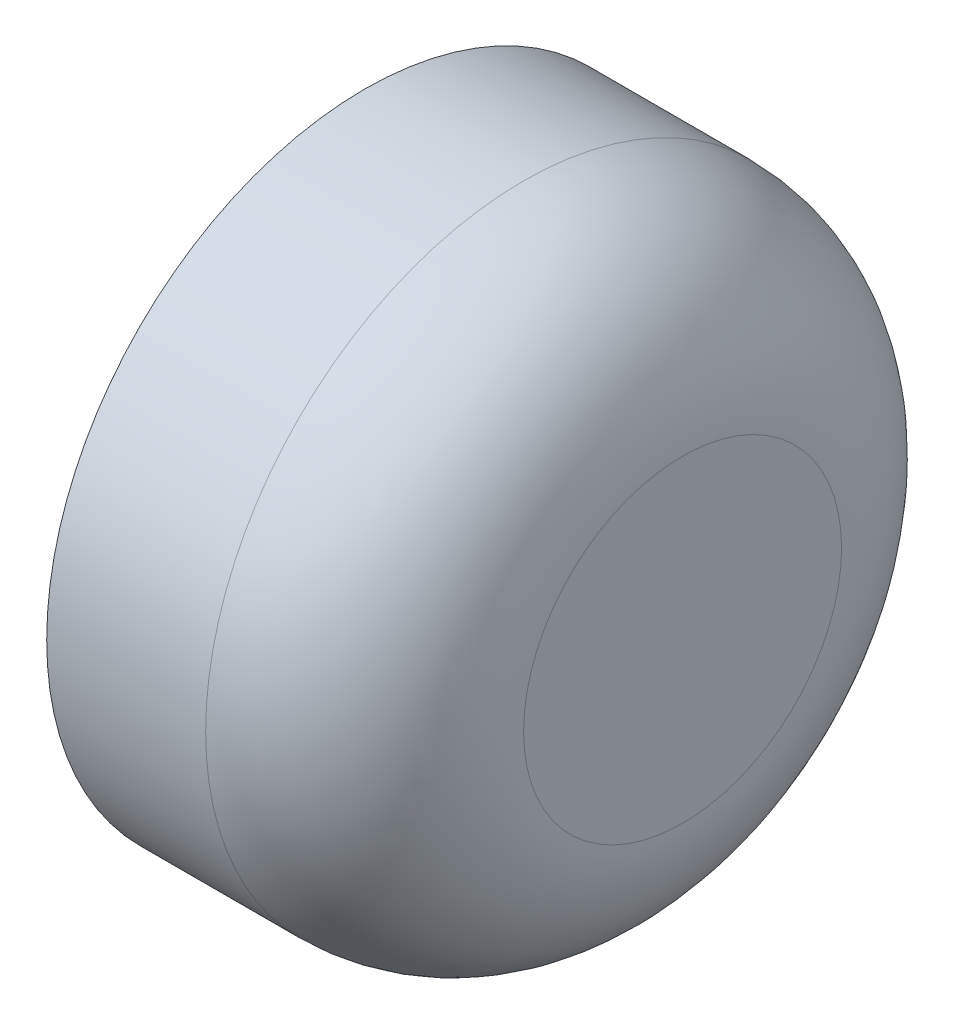
ISO-10303-21;
HEADER;
FILE_DESCRIPTION(('STEP AP214'),'2;1');
FILE_NAME('part.step','',(''),(''),'','','');
FILE_SCHEMA(('AUTOMOTIVE_DESIGN { 1 0 10303 214 1 1 1 1 }'));
ENDSEC;
DATA;
#1=APPLICATION_CONTEXT('core data for automotive mechanical design processes');
#2=APPLICATION_PROTOCOL_DEFINITION('international standard','automotive_design',2000,#1);
#3=PRODUCT_CONTEXT('',#1,'mechanical');
#4=PRODUCT('Part','Part','',(#3));
#5=PRODUCT_RELATED_PRODUCT_CATEGORY('part','',(#4));
#6=PRODUCT_DEFINITION_FORMATION('','',#4);
#7=PRODUCT_DEFINITION_CONTEXT('part definition',#1,'design');
#8=PRODUCT_DEFINITION('design','',#6,#7);
#9=PRODUCT_DEFINITION_SHAPE('','',#8);
#10=(LENGTH_UNIT() NAMED_UNIT(*) SI_UNIT(.MILLI.,.METRE.));
#11=(NAMED_UNIT(*) PLANE_ANGLE_UNIT() SI_UNIT($,.RADIAN.));
#12=(NAMED_UNIT(*) SI_UNIT($,.STERADIAN.) SOLID_ANGLE_UNIT());
#13=UNCERTAINTY_MEASURE_WITH_UNIT(LENGTH_MEASURE(1.E-05),#10,'distance_accuracy_value','');
#14=(GEOMETRIC_REPRESENTATION_CONTEXT(3) GLOBAL_UNCERTAINTY_ASSIGNED_CONTEXT((#13)) GLOBAL_UNIT_ASSIGNED_CONTEXT((#10,
#11,#12)) REPRESENTATION_CONTEXT('',''));
#15=CARTESIAN_POINT('',(0.,0.,0.));
#16=DIRECTION('',(0.,0.,1.));
#17=DIRECTION('',(1.,0.,0.));
#18=AXIS2_PLACEMENT_3D('',#15,#16,#17);
#19=CARTESIAN_POINT('',(1.,0.,0.));
#20=DIRECTION('',(-1.,0.,0.));
#21=DIRECTION('',(0.,0.,1.));
#22=AXIS2_PLACEMENT_3D('',#19,#20,#21);
#23=CYLINDRICAL_SURFACE('',#22,1.);
#24=CARTESIAN_POINT('',(0.5,0.,0.));
#25=DIRECTION('',(1.,0.,0.));
#26=DIRECTION('',(0.,0.,-1.));
#27=AXIS2_PLACEMENT_3D('',#24,#25,#26);
#28=CIRCLE('',#27,1.);
#29=CARTESIAN_POINT('',(0.5,0.,-1.));
#30=VERTEX_POINT('',#29);
#31=EDGE_CURVE('E10',#30,#30,#28,.F.);
#32=ORIENTED_EDGE('',*,*,#31,.T.);
#33=EDGE_LOOP('',(#32));
#34=FACE_BOUND('',#33,.T.);
#35=CARTESIAN_POINT('',(0.,0.,0.));
#36=DIRECTION('',(1.,0.,0.));
#37=DIRECTION('',(0.,0.,-1.));
#38=AXIS2_PLACEMENT_3D('',#35,#36,#37);
#39=CIRCLE('',#38,1.);
#40=CARTESIAN_POINT('',(0.,0.,-1.));
#41=VERTEX_POINT('',#40);
#42=EDGE_CURVE('E44',#41,#41,#39,.T.);
#43=ORIENTED_EDGE('',*,*,#42,.T.);
#44=EDGE_LOOP('',(#43));
#45=FACE_BOUND('',#44,.T.);
#46=ADVANCED_FACE('F33',(#34,#45),#23,.T.);
#47=CARTESIAN_POINT('',(1.,0.,0.));
#48=DIRECTION('',(1.,0.,0.));
#49=DIRECTION('',(0.,0.,-1.));
#50=AXIS2_PLACEMENT_3D('',#47,#48,#49);
#51=PLANE('',#50);
#52=CARTESIAN_POINT('',(1.,0.,0.));
#53=DIRECTION('',(1.,0.,0.));
#54=DIRECTION('',(0.,0.,-1.));
#55=AXIS2_PLACEMENT_3D('',#52,#53,#54);
#56=CIRCLE('',#55,0.5);
#57=CARTESIAN_POINT('',(1.,0.,-0.5));
#58=VERTEX_POINT('',#57);
#59=EDGE_CURVE('E40',#58,#58,#56,.T.);
#60=ORIENTED_EDGE('',*,*,#59,.T.);
#61=EDGE_LOOP('',(#60));
#62=FACE_BOUND('',#61,.T.);
#63=ADVANCED_FACE('F54',(#62),#51,.T.);
#64=CARTESIAN_POINT('',(0.,0.,0.));
#65=DIRECTION('',(1.,0.,0.));
#66=DIRECTION('',(0.,0.,-1.));
#67=AXIS2_PLACEMENT_3D('',#64,#65,#66);
#68=PLANE('',#67);
#69=ORIENTED_EDGE('',*,*,#42,.F.);
#70=EDGE_LOOP('',(#69));
#71=FACE_BOUND('',#70,.T.);
#72=ADVANCED_FACE('F52',(#71),#68,.F.);
#73=CARTESIAN_POINT('',(0.5,0.,0.));
#74=DIRECTION('',(1.,0.,0.));
#75=DIRECTION('',(0.,0.,-1.));
#76=AXIS2_PLACEMENT_3D('',#73,#74,#75);
#77=DEGENERATE_TOROIDAL_SURFACE('',#76,0.5,0.5,.T.);
#78=ORIENTED_EDGE('',*,*,#31,.F.);
#79=EDGE_LOOP('',(#78));
#80=FACE_BOUND('',#79,.T.);
#81=ORIENTED_EDGE('',*,*,#59,.F.);
#82=EDGE_LOOP('',(#81));
#83=FACE_BOUND('',#82,.T.);
#84=ADVANCED_FACE('F35',(#80,#83),#77,.T.);
#85=CLOSED_SHELL('',(#46,#63,#72,#84));
#86=MANIFOLD_SOLID_BREP('B2',#85);
#87=ADVANCED_BREP_SHAPE_REPRESENTATION('',(#18,#86),#14);
#88=SHAPE_DEFINITION_REPRESENTATION(#9,#87);
ENDSEC;
END-ISO-10303-21;
